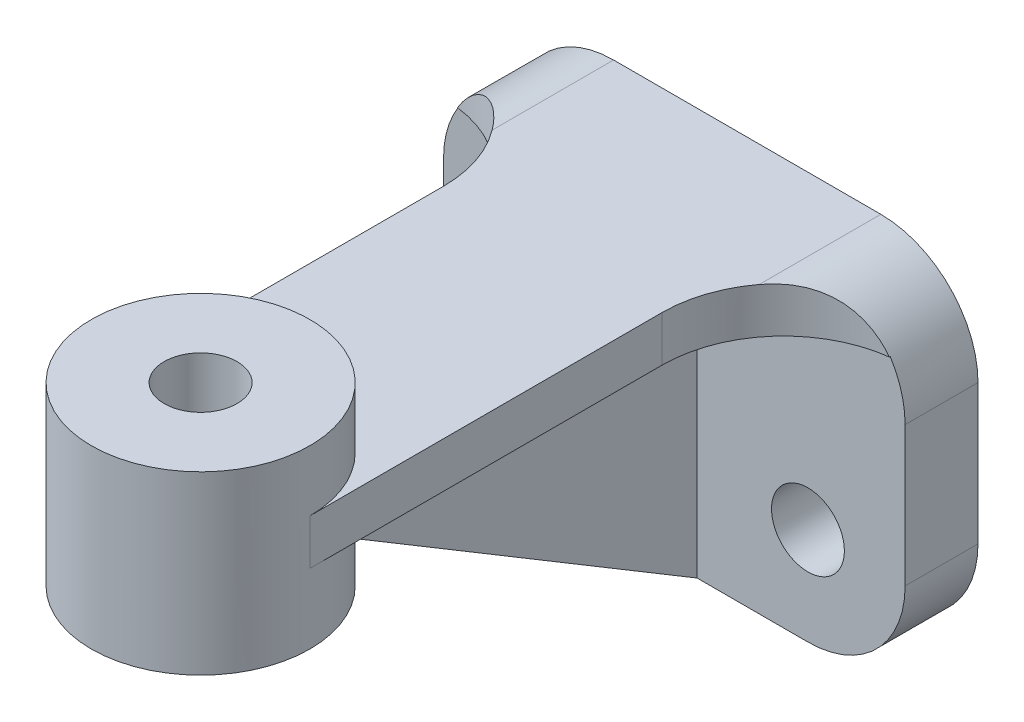
ISO-10303-21;
HEADER;
FILE_DESCRIPTION(('STEP AP214'),'2;1');
FILE_NAME('part.step','',(''),(''),'','','');
FILE_SCHEMA(('AUTOMOTIVE_DESIGN { 1 0 10303 214 1 1 1 1 }'));
ENDSEC;
DATA;
#1=APPLICATION_CONTEXT('core data for automotive mechanical design processes');
#2=APPLICATION_PROTOCOL_DEFINITION('international standard','automotive_design',2000,#1);
#3=PRODUCT_CONTEXT('',#1,'mechanical');
#4=PRODUCT('Part','Part','',(#3));
#5=PRODUCT_RELATED_PRODUCT_CATEGORY('part','',(#4));
#6=PRODUCT_DEFINITION_FORMATION('','',#4);
#7=PRODUCT_DEFINITION_CONTEXT('part definition',#1,'design');
#8=PRODUCT_DEFINITION('design','',#6,#7);
#9=PRODUCT_DEFINITION_SHAPE('','',#8);
#10=(LENGTH_UNIT() NAMED_UNIT(*) SI_UNIT(.MILLI.,.METRE.));
#11=(NAMED_UNIT(*) PLANE_ANGLE_UNIT() SI_UNIT($,.RADIAN.));
#12=(NAMED_UNIT(*) SI_UNIT($,.STERADIAN.) SOLID_ANGLE_UNIT());
#13=UNCERTAINTY_MEASURE_WITH_UNIT(LENGTH_MEASURE(1.E-05),#10,'distance_accuracy_value','');
#14=(GEOMETRIC_REPRESENTATION_CONTEXT(3) GLOBAL_UNCERTAINTY_ASSIGNED_CONTEXT((#13)) GLOBAL_UNIT_ASSIGNED_CONTEXT((#10,
#11,#12)) REPRESENTATION_CONTEXT('',''));
#15=CARTESIAN_POINT('',(0.,0.,0.));
#16=DIRECTION('',(0.,0.,1.));
#17=DIRECTION('',(1.,0.,0.));
#18=AXIS2_PLACEMENT_3D('',#15,#16,#17);
#19=CARTESIAN_POINT('',(0.,-55.,6.));
#20=DIRECTION('',(0.,0.,1.));
#21=DIRECTION('',(1.,0.,0.));
#22=AXIS2_PLACEMENT_3D('',#19,#20,#21);
#23=PLANE('',#22);
#24=CARTESIAN_POINT('',(22.,-39.,6.));
#25=DIRECTION('',(0.,0.,1.));
#26=DIRECTION('',(1.,0.,0.));
#27=AXIS2_PLACEMENT_3D('',#24,#25,#26);
#28=CIRCLE('',#27,5.99999999999999);
#29=CARTESIAN_POINT('',(28.,-39.,6.));
#30=VERTEX_POINT('',#29);
#31=EDGE_CURVE('E212',#30,#30,#28,.T.);
#32=ORIENTED_EDGE('',*,*,#31,.F.);
#33=EDGE_LOOP('',(#32));
#34=FACE_BOUND('',#33,.T.);
#35=CARTESIAN_POINT('',(22.,-16.,6.));
#36=DIRECTION('',(0.,0.,1.));
#37=DIRECTION('',(1.,0.,0.));
#38=AXIS2_PLACEMENT_3D('',#35,#36,#37);
#39=CIRCLE('',#38,16.);
#40=CARTESIAN_POINT('',(38.,-16.,6.));
#41=VERTEX_POINT('',#40);
#42=CARTESIAN_POINT('',(35.5554417117259,-7.5,6.));
#43=VERTEX_POINT('',#42);
#44=EDGE_CURVE('E295',#41,#43,#39,.T.);
#45=ORIENTED_EDGE('',*,*,#44,.T.);
#46=DIRECTION('',(1.,0.,0.));
#47=VECTOR('',#46,1.);
#48=CARTESIAN_POINT('',(0.,-7.5,6.));
#49=LINE('',#48,#47);
#50=CARTESIAN_POINT('',(3.75,-7.5,6.));
#51=VERTEX_POINT('',#50);
#52=EDGE_CURVE('E234',#51,#43,#49,.T.);
#53=ORIENTED_EDGE('',*,*,#52,.F.);
#54=DIRECTION('',(0.,-1.,0.));
#55=VECTOR('',#54,1.);
#56=CARTESIAN_POINT('',(3.75,-55.,6.));
#57=LINE('',#56,#55);
#58=CARTESIAN_POINT('',(3.75,-55.,5.99999999999998));
#59=VERTEX_POINT('',#58);
#60=EDGE_CURVE('E372',#51,#59,#57,.T.);
#61=ORIENTED_EDGE('',*,*,#60,.T.);
#62=DIRECTION('',(1.,0.,0.));
#63=VECTOR('',#62,1.);
#64=CARTESIAN_POINT('',(0.,-55.,6.));
#65=LINE('',#64,#63);
#66=CARTESIAN_POINT('',(22.,-55.,6.));
#67=VERTEX_POINT('',#66);
#68=EDGE_CURVE('E256',#59,#67,#65,.T.);
#69=ORIENTED_EDGE('',*,*,#68,.T.);
#70=CARTESIAN_POINT('',(22.,-39.,6.));
#71=DIRECTION('',(0.,0.,1.));
#72=DIRECTION('',(1.,0.,0.));
#73=AXIS2_PLACEMENT_3D('',#70,#71,#72);
#74=CIRCLE('',#73,16.);
#75=CARTESIAN_POINT('',(38.,-39.,6.));
#76=VERTEX_POINT('',#75);
#77=EDGE_CURVE('E298',#67,#76,#74,.T.);
#78=ORIENTED_EDGE('',*,*,#77,.T.);
#79=DIRECTION('',(0.,1.,0.));
#80=VECTOR('',#79,1.);
#81=CARTESIAN_POINT('',(38.,-55.,6.));
#82=LINE('',#81,#80);
#83=EDGE_CURVE('E258',#76,#41,#82,.T.);
#84=ORIENTED_EDGE('',*,*,#83,.T.);
#85=EDGE_LOOP('',(#45,#53,#61,#69,#78,#84));
#86=FACE_BOUND('',#85,.T.);
#87=ADVANCED_FACE('F41',(#34,#86),#23,.T.);
#88=CARTESIAN_POINT('',(0.,-7.5,0.));
#89=DIRECTION('',(0.,1.,0.));
#90=DIRECTION('',(0.,0.,1.));
#91=AXIS2_PLACEMENT_3D('',#88,#89,#90);
#92=PLANE('',#91);
#93=DIRECTION('',(0.,0.,1.));
#94=VECTOR('',#93,1.);
#95=CARTESIAN_POINT('',(3.75,-7.5,0.));
#96=LINE('',#95,#94);
#97=CARTESIAN_POINT('',(3.75000000000001,-7.5,66.3949581085418));
#98=VERTEX_POINT('',#97);
#99=EDGE_CURVE('E177',#51,#98,#96,.T.);
#100=ORIENTED_EDGE('',*,*,#99,.F.);
#101=ORIENTED_EDGE('',*,*,#52,.T.);
#102=DIRECTION('',(0.,0.,-1.));
#103=VECTOR('',#102,1.);
#104=CARTESIAN_POINT('',(35.555441711726,-7.5,6.14995882182531));
#105=LINE('',#104,#103);
#106=CARTESIAN_POINT('',(35.555441711726,-7.5,6.14995882182531));
#107=VERTEX_POINT('',#106);
#108=EDGE_CURVE('E11',#43,#107,#105,.F.);
#109=ORIENTED_EDGE('',*,*,#108,.T.);
#110=CARTESIAN_POINT('',(38.,-7.5,26.));
#111=DIRECTION('',(0.,1.,0.));
#112=DIRECTION('',(0.,0.,1.));
#113=AXIS2_PLACEMENT_3D('',#110,#111,#112);
#114=CIRCLE('',#113,20.);
#115=CARTESIAN_POINT('',(18.,-7.5,26.));
#116=VERTEX_POINT('',#115);
#117=EDGE_CURVE('E325',#107,#116,#114,.T.);
#118=ORIENTED_EDGE('',*,*,#117,.T.);
#119=DIRECTION('',(0.,0.,1.));
#120=VECTOR('',#119,1.);
#121=CARTESIAN_POINT('',(18.,-7.5,0.));
#122=LINE('',#121,#120);
#123=CARTESIAN_POINT('',(18.,-7.5,84.));
#124=VERTEX_POINT('',#123);
#125=EDGE_CURVE('E231',#116,#124,#122,.T.);
#126=ORIENTED_EDGE('',*,*,#125,.T.);
#127=CARTESIAN_POINT('',(0.,-7.5,84.));
#128=DIRECTION('',(0.,1.,0.));
#129=DIRECTION('',(0.,0.,1.));
#130=AXIS2_PLACEMENT_3D('',#127,#128,#129);
#131=CIRCLE('',#130,18.);
#132=EDGE_CURVE('E229',#124,#98,#131,.T.);
#133=ORIENTED_EDGE('',*,*,#132,.T.);
#134=EDGE_LOOP('',(#100,#101,#109,#118,#126,#133));
#135=FACE_BOUND('',#134,.T.);
#136=ADVANCED_FACE('F360',(#135),#92,.F.);
#137=CARTESIAN_POINT('',(-35.555441711726,-7.5,6.));
#138=VERTEX_POINT('',#137);
#139=CARTESIAN_POINT('',(-3.75,-7.5,6.));
#140=VERTEX_POINT('',#139);
#141=EDGE_CURVE('E235',#138,#140,#49,.T.);
#142=ORIENTED_EDGE('',*,*,#141,.F.);
#143=CARTESIAN_POINT('',(-22.,-16.,6.));
#144=DIRECTION('',(0.,0.,1.));
#145=DIRECTION('',(1.,0.,0.));
#146=AXIS2_PLACEMENT_3D('',#143,#144,#145);
#147=CIRCLE('',#146,16.);
#148=CARTESIAN_POINT('',(-38.,-16.,6.));
#149=VERTEX_POINT('',#148);
#150=EDGE_CURVE('E291',#138,#149,#147,.T.);
#151=ORIENTED_EDGE('',*,*,#150,.T.);
#152=DIRECTION('',(0.,1.,0.));
#153=VECTOR('',#152,1.);
#154=CARTESIAN_POINT('',(-38.,-55.,6.));
#155=LINE('',#154,#153);
#156=CARTESIAN_POINT('',(-38.,-39.,6.));
#157=VERTEX_POINT('',#156);
#158=EDGE_CURVE('E260',#157,#149,#155,.T.);
#159=ORIENTED_EDGE('',*,*,#158,.F.);
#160=CARTESIAN_POINT('',(-22.,-39.,6.));
#161=DIRECTION('',(0.,0.,1.));
#162=DIRECTION('',(1.,0.,0.));
#163=AXIS2_PLACEMENT_3D('',#160,#161,#162);
#164=CIRCLE('',#163,16.);
#165=CARTESIAN_POINT('',(-22.,-55.,6.));
#166=VERTEX_POINT('',#165);
#167=EDGE_CURVE('E293',#157,#166,#164,.T.);
#168=ORIENTED_EDGE('',*,*,#167,.T.);
#169=CARTESIAN_POINT('',(-3.75,-55.,5.99999999999998));
#170=VERTEX_POINT('',#169);
#171=EDGE_CURVE('E252',#166,#170,#65,.T.);
#172=ORIENTED_EDGE('',*,*,#171,.T.);
#173=DIRECTION('',(0.,-1.,0.));
#174=VECTOR('',#173,1.);
#175=CARTESIAN_POINT('',(-3.75,-55.,6.));
#176=LINE('',#175,#174);
#177=EDGE_CURVE('E182',#140,#170,#176,.T.);
#178=ORIENTED_EDGE('',*,*,#177,.F.);
#179=EDGE_LOOP('',(#142,#151,#159,#168,#172,#178));
#180=FACE_BOUND('',#179,.T.);
#181=CARTESIAN_POINT('',(-22.,-39.,6.));
#182=DIRECTION('',(0.,0.,1.));
#183=DIRECTION('',(1.,0.,0.));
#184=AXIS2_PLACEMENT_3D('',#181,#182,#183);
#185=CIRCLE('',#184,5.99999999999999);
#186=CARTESIAN_POINT('',(-16.,-39.,6.));
#187=VERTEX_POINT('',#186);
#188=EDGE_CURVE('E200',#187,#187,#185,.T.);
#189=ORIENTED_EDGE('',*,*,#188,.F.);
#190=EDGE_LOOP('',(#189));
#191=FACE_BOUND('',#190,.T.);
#192=ADVANCED_FACE('F414',(#180,#191),#23,.T.);
#193=CARTESIAN_POINT('',(-38.,-55.,0.));
#194=DIRECTION('',(1.,0.,0.));
#195=DIRECTION('',(0.,0.,-1.));
#196=AXIS2_PLACEMENT_3D('',#193,#194,#195);
#197=PLANE('',#196);
#198=DIRECTION('',(0.,1.,0.));
#199=VECTOR('',#198,1.);
#200=CARTESIAN_POINT('',(-38.,-55.,-6.));
#201=LINE('',#200,#199);
#202=CARTESIAN_POINT('',(-38.,-39.,-6.));
#203=VERTEX_POINT('',#202);
#204=CARTESIAN_POINT('',(-38.,-16.,-6.));
#205=VERTEX_POINT('',#204);
#206=EDGE_CURVE('E264',#203,#205,#201,.T.);
#207=ORIENTED_EDGE('',*,*,#206,.F.);
#208=DIRECTION('',(0.,0.,-1.));
#209=VECTOR('',#208,1.);
#210=CARTESIAN_POINT('',(-38.,-39.,0.));
#211=LINE('',#210,#209);
#212=EDGE_CURVE('E308',#203,#157,#211,.F.);
#213=ORIENTED_EDGE('',*,*,#212,.T.);
#214=ORIENTED_EDGE('',*,*,#158,.T.);
#215=DIRECTION('',(0.,0.,-1.));
#216=VECTOR('',#215,1.);
#217=CARTESIAN_POINT('',(-38.,-16.,-6.));
#218=LINE('',#217,#216);
#219=EDGE_CURVE('E305',#149,#205,#218,.T.);
#220=ORIENTED_EDGE('',*,*,#219,.T.);
#221=EDGE_LOOP('',(#207,#213,#214,#220));
#222=FACE_BOUND('',#221,.T.);
#223=ADVANCED_FACE('F421',(#222),#197,.F.);
#224=CARTESIAN_POINT('',(0.,-55.,-6.));
#225=DIRECTION('',(0.,0.,1.));
#226=DIRECTION('',(1.,0.,0.));
#227=AXIS2_PLACEMENT_3D('',#224,#225,#226);
#228=PLANE('',#227);
#229=CARTESIAN_POINT('',(-22.,-39.,-6.));
#230=DIRECTION('',(0.,0.,1.));
#231=DIRECTION('',(1.,0.,0.));
#232=AXIS2_PLACEMENT_3D('',#229,#230,#231);
#233=CIRCLE('',#232,5.99999999999999);
#234=CARTESIAN_POINT('',(-16.,-39.,-6.));
#235=VERTEX_POINT('',#234);
#236=EDGE_CURVE('E209',#235,#235,#233,.T.);
#237=ORIENTED_EDGE('',*,*,#236,.T.);
#238=EDGE_LOOP('',(#237));
#239=FACE_BOUND('',#238,.T.);
#240=DIRECTION('',(1.,0.,0.));
#241=VECTOR('',#240,1.);
#242=CARTESIAN_POINT('',(0.,0.,-6.));
#243=LINE('',#242,#241);
#244=CARTESIAN_POINT('',(-22.,0.,-6.));
#245=VERTEX_POINT('',#244);
#246=CARTESIAN_POINT('',(22.,0.,-6.));
#247=VERTEX_POINT('',#246);
#248=EDGE_CURVE('E249',#245,#247,#243,.T.);
#249=ORIENTED_EDGE('',*,*,#248,.T.);
#250=CARTESIAN_POINT('',(22.,-16.,-6.));
#251=DIRECTION('',(0.,0.,1.));
#252=DIRECTION('',(1.,0.,0.));
#253=AXIS2_PLACEMENT_3D('',#250,#251,#252);
#254=CIRCLE('',#253,16.);
#255=CARTESIAN_POINT('',(38.,-16.,-6.));
#256=VERTEX_POINT('',#255);
#257=EDGE_CURVE('E280',#247,#256,#254,.F.);
#258=ORIENTED_EDGE('',*,*,#257,.T.);
#259=DIRECTION('',(0.,1.,0.));
#260=VECTOR('',#259,1.);
#261=CARTESIAN_POINT('',(38.,-55.,-6.));
#262=LINE('',#261,#260);
#263=CARTESIAN_POINT('',(38.,-39.,-6.));
#264=VERTEX_POINT('',#263);
#265=EDGE_CURVE('E267',#264,#256,#262,.T.);
#266=ORIENTED_EDGE('',*,*,#265,.F.);
#267=CARTESIAN_POINT('',(22.,-39.,-6.));
#268=DIRECTION('',(0.,0.,1.));
#269=DIRECTION('',(1.,0.,0.));
#270=AXIS2_PLACEMENT_3D('',#267,#268,#269);
#271=CIRCLE('',#270,16.);
#272=CARTESIAN_POINT('',(22.,-55.,-6.));
#273=VERTEX_POINT('',#272);
#274=EDGE_CURVE('E282',#264,#273,#271,.F.);
#275=ORIENTED_EDGE('',*,*,#274,.T.);
#276=DIRECTION('',(1.,0.,0.));
#277=VECTOR('',#276,1.);
#278=CARTESIAN_POINT('',(0.,-55.,-6.));
#279=LINE('',#278,#277);
#280=CARTESIAN_POINT('',(-22.,-55.,-6.));
#281=VERTEX_POINT('',#280);
#282=EDGE_CURVE('E255',#281,#273,#279,.T.);
#283=ORIENTED_EDGE('',*,*,#282,.F.);
#284=CARTESIAN_POINT('',(-22.,-39.,-6.));
#285=DIRECTION('',(0.,0.,1.));
#286=DIRECTION('',(1.,0.,0.));
#287=AXIS2_PLACEMENT_3D('',#284,#285,#286);
#288=CIRCLE('',#287,16.);
#289=EDGE_CURVE('E278',#281,#203,#288,.F.);
#290=ORIENTED_EDGE('',*,*,#289,.T.);
#291=ORIENTED_EDGE('',*,*,#206,.T.);
#292=CARTESIAN_POINT('',(-22.,-16.,-6.));
#293=DIRECTION('',(0.,0.,1.));
#294=DIRECTION('',(1.,0.,0.));
#295=AXIS2_PLACEMENT_3D('',#292,#293,#294);
#296=CIRCLE('',#295,16.);
#297=EDGE_CURVE('E276',#205,#245,#296,.F.);
#298=ORIENTED_EDGE('',*,*,#297,.T.);
#299=EDGE_LOOP('',(#249,#258,#266,#275,#283,#290,#291,#298));
#300=FACE_BOUND('',#299,.T.);
#301=CARTESIAN_POINT('',(22.,-39.,-6.));
#302=DIRECTION('',(0.,0.,1.));
#303=DIRECTION('',(1.,0.,0.));
#304=AXIS2_PLACEMENT_3D('',#301,#302,#303);
#305=CIRCLE('',#304,5.99999999999999);
#306=CARTESIAN_POINT('',(28.,-39.,-6.));
#307=VERTEX_POINT('',#306);
#308=EDGE_CURVE('E215',#307,#307,#305,.T.);
#309=ORIENTED_EDGE('',*,*,#308,.T.);
#310=EDGE_LOOP('',(#309));
#311=FACE_BOUND('',#310,.T.);
#312=ADVANCED_FACE('F385',(#239,#300,#311),#228,.F.);
#313=CARTESIAN_POINT('',(38.,-55.,0.));
#314=DIRECTION('',(1.,0.,0.));
#315=DIRECTION('',(0.,0.,-1.));
#316=AXIS2_PLACEMENT_3D('',#313,#314,#315);
#317=PLANE('',#316);
#318=ORIENTED_EDGE('',*,*,#83,.F.);
#319=DIRECTION('',(0.,0.,-1.));
#320=VECTOR('',#319,1.);
#321=CARTESIAN_POINT('',(38.,-39.,-6.));
#322=LINE('',#321,#320);
#323=EDGE_CURVE('E273',#76,#264,#322,.T.);
#324=ORIENTED_EDGE('',*,*,#323,.T.);
#325=ORIENTED_EDGE('',*,*,#265,.T.);
#326=DIRECTION('',(0.,0.,-1.));
#327=VECTOR('',#326,1.);
#328=CARTESIAN_POINT('',(38.,-16.,0.));
#329=LINE('',#328,#327);
#330=EDGE_CURVE('E263',#256,#41,#329,.F.);
#331=ORIENTED_EDGE('',*,*,#330,.T.);
#332=EDGE_LOOP('',(#318,#324,#325,#331));
#333=FACE_BOUND('',#332,.T.);
#334=ADVANCED_FACE('F381',(#333),#317,.T.);
#335=CARTESIAN_POINT('',(0.,-55.,0.));
#336=DIRECTION('',(0.,1.,0.));
#337=DIRECTION('',(0.,0.,1.));
#338=AXIS2_PLACEMENT_3D('',#335,#336,#337);
#339=PLANE('',#338);
#340=ORIENTED_EDGE('',*,*,#282,.T.);
#341=DIRECTION('',(0.,0.,-1.));
#342=VECTOR('',#341,1.);
#343=CARTESIAN_POINT('',(22.,-55.,6.));
#344=LINE('',#343,#342);
#345=EDGE_CURVE('E288',#273,#67,#344,.F.);
#346=ORIENTED_EDGE('',*,*,#345,.T.);
#347=ORIENTED_EDGE('',*,*,#68,.F.);
#348=DIRECTION('',(-1.,0.,0.));
#349=VECTOR('',#348,1.);
#350=CARTESIAN_POINT('',(0.,-55.,6.00000000000001));
#351=LINE('',#350,#349);
#352=EDGE_CURVE('E190',#170,#59,#351,.F.);
#353=ORIENTED_EDGE('',*,*,#352,.F.);
#354=ORIENTED_EDGE('',*,*,#171,.F.);
#355=DIRECTION('',(0.,0.,-1.));
#356=VECTOR('',#355,1.);
#357=CARTESIAN_POINT('',(-22.,-55.,0.));
#358=LINE('',#357,#356);
#359=EDGE_CURVE('E285',#166,#281,#358,.T.);
#360=ORIENTED_EDGE('',*,*,#359,.T.);
#361=EDGE_LOOP('',(#340,#346,#347,#353,#354,#360));
#362=FACE_BOUND('',#361,.T.);
#363=ADVANCED_FACE('F412',(#362),#339,.F.);
#364=CARTESIAN_POINT('',(0.,0.,0.));
#365=DIRECTION('',(0.,1.,0.));
#366=DIRECTION('',(0.,0.,1.));
#367=AXIS2_PLACEMENT_3D('',#364,#365,#366);
#368=PLANE('',#367);
#369=DIRECTION('',(0.,0.,-1.));
#370=VECTOR('',#369,1.);
#371=CARTESIAN_POINT('',(-22.,0.,6.));
#372=LINE('',#371,#370);
#373=CARTESIAN_POINT('',(-22.,0.,13.9999999999999));
#374=VERTEX_POINT('',#373);
#375=EDGE_CURVE('E300',#245,#374,#372,.F.);
#376=ORIENTED_EDGE('',*,*,#375,.T.);
#377=CARTESIAN_POINT('',(-38.,0.,26.));
#378=DIRECTION('',(0.,1.,0.));
#379=DIRECTION('',(0.,0.,1.));
#380=AXIS2_PLACEMENT_3D('',#377,#378,#379);
#381=CIRCLE('',#380,20.);
#382=CARTESIAN_POINT('',(-18.,0.,26.));
#383=VERTEX_POINT('',#382);
#384=EDGE_CURVE('E353',#374,#383,#381,.F.);
#385=ORIENTED_EDGE('',*,*,#384,.T.);
#386=DIRECTION('',(0.,0.,1.));
#387=VECTOR('',#386,1.);
#388=CARTESIAN_POINT('',(-18.,0.,0.));
#389=LINE('',#388,#387);
#390=CARTESIAN_POINT('',(-18.,0.,84.));
#391=VERTEX_POINT('',#390);
#392=EDGE_CURVE('E244',#383,#391,#389,.T.);
#393=ORIENTED_EDGE('',*,*,#392,.T.);
#394=CARTESIAN_POINT('',(0.,0.,84.));
#395=DIRECTION('',(0.,1.,0.));
#396=DIRECTION('',(0.,0.,1.));
#397=AXIS2_PLACEMENT_3D('',#394,#395,#396);
#398=CIRCLE('',#397,18.);
#399=CARTESIAN_POINT('',(18.,0.,84.));
#400=VERTEX_POINT('',#399);
#401=EDGE_CURVE('E228',#400,#391,#398,.T.);
#402=ORIENTED_EDGE('',*,*,#401,.F.);
#403=DIRECTION('',(0.,0.,1.));
#404=VECTOR('',#403,1.);
#405=CARTESIAN_POINT('',(18.,0.,0.));
#406=LINE('',#405,#404);
#407=CARTESIAN_POINT('',(18.,0.,26.));
#408=VERTEX_POINT('',#407);
#409=EDGE_CURVE('E242',#408,#400,#406,.T.);
#410=ORIENTED_EDGE('',*,*,#409,.F.);
#411=CARTESIAN_POINT('',(38.,0.,26.));
#412=DIRECTION('',(0.,1.,0.));
#413=DIRECTION('',(0.,0.,1.));
#414=AXIS2_PLACEMENT_3D('',#411,#412,#413);
#415=CIRCLE('',#414,20.);
#416=CARTESIAN_POINT('',(22.,0.,13.9999999999999));
#417=VERTEX_POINT('',#416);
#418=EDGE_CURVE('E316',#408,#417,#415,.F.);
#419=ORIENTED_EDGE('',*,*,#418,.T.);
#420=DIRECTION('',(0.,0.,-1.));
#421=VECTOR('',#420,1.);
#422=CARTESIAN_POINT('',(22.,0.,0.));
#423=LINE('',#422,#421);
#424=EDGE_CURVE('E302',#417,#247,#423,.T.);
#425=ORIENTED_EDGE('',*,*,#424,.T.);
#426=ORIENTED_EDGE('',*,*,#248,.F.);
#427=EDGE_LOOP('',(#376,#385,#393,#402,#410,#419,#425,#426));
#428=FACE_BOUND('',#427,.T.);
#429=ADVANCED_FACE('F367',(#428),#368,.T.);
#430=CARTESIAN_POINT('',(-18.,-7.5,0.));
#431=DIRECTION('',(-1.,0.,0.));
#432=DIRECTION('',(0.,0.,1.));
#433=AXIS2_PLACEMENT_3D('',#430,#431,#432);
#434=PLANE('',#433);
#435=ORIENTED_EDGE('',*,*,#392,.F.);
#436=DIRECTION('',(0.,1.,0.));
#437=VECTOR('',#436,1.);
#438=CARTESIAN_POINT('',(-18.,-7.5,26.));
#439=LINE('',#438,#437);
#440=CARTESIAN_POINT('',(-18.,-7.5,26.));
#441=VERTEX_POINT('',#440);
#442=EDGE_CURVE('E313',#383,#441,#439,.F.);
#443=ORIENTED_EDGE('',*,*,#442,.T.);
#444=DIRECTION('',(0.,0.,1.));
#445=VECTOR('',#444,1.);
#446=CARTESIAN_POINT('',(-18.,-7.5,0.));
#447=LINE('',#446,#445);
#448=CARTESIAN_POINT('',(-18.,-7.5,84.));
#449=VERTEX_POINT('',#448);
#450=EDGE_CURVE('E238',#441,#449,#447,.T.);
#451=ORIENTED_EDGE('',*,*,#450,.T.);
#452=DIRECTION('',(0.,1.,0.));
#453=VECTOR('',#452,1.);
#454=CARTESIAN_POINT('',(-18.,-7.5,84.));
#455=LINE('',#454,#453);
#456=EDGE_CURVE('E246',#449,#391,#455,.T.);
#457=ORIENTED_EDGE('',*,*,#456,.T.);
#458=EDGE_LOOP('',(#435,#443,#451,#457));
#459=FACE_BOUND('',#458,.T.);
#460=ADVANCED_FACE('F396',(#459),#434,.T.);
#461=CARTESIAN_POINT('',(18.,-7.5,0.));
#462=DIRECTION('',(-1.,0.,0.));
#463=DIRECTION('',(0.,0.,1.));
#464=AXIS2_PLACEMENT_3D('',#461,#462,#463);
#465=PLANE('',#464);
#466=ORIENTED_EDGE('',*,*,#125,.F.);
#467=DIRECTION('',(0.,1.,0.));
#468=VECTOR('',#467,1.);
#469=CARTESIAN_POINT('',(18.,-7.5,26.));
#470=LINE('',#469,#468);
#471=EDGE_CURVE('E310',#116,#408,#470,.T.);
#472=ORIENTED_EDGE('',*,*,#471,.T.);
#473=ORIENTED_EDGE('',*,*,#409,.T.);
#474=DIRECTION('',(0.,1.,0.));
#475=VECTOR('',#474,1.);
#476=CARTESIAN_POINT('',(18.,-7.5,84.));
#477=LINE('',#476,#475);
#478=EDGE_CURVE('E240',#124,#400,#477,.T.);
#479=ORIENTED_EDGE('',*,*,#478,.F.);
#480=EDGE_LOOP('',(#466,#472,#473,#479));
#481=FACE_BOUND('',#480,.T.);
#482=ADVANCED_FACE('F365',(#481),#465,.F.);
#483=ORIENTED_EDGE('',*,*,#141,.T.);
#484=DIRECTION('',(0.,0.,1.));
#485=VECTOR('',#484,1.);
#486=CARTESIAN_POINT('',(-3.75,-7.5,0.));
#487=LINE('',#486,#485);
#488=CARTESIAN_POINT('',(-3.74999999999999,-7.5,66.3949581085417));
#489=VERTEX_POINT('',#488);
#490=EDGE_CURVE('E204',#140,#489,#487,.T.);
#491=ORIENTED_EDGE('',*,*,#490,.T.);
#492=EDGE_CURVE('E232',#489,#449,#131,.T.);
#493=ORIENTED_EDGE('',*,*,#492,.T.);
#494=ORIENTED_EDGE('',*,*,#450,.F.);
#495=CARTESIAN_POINT('',(-38.,-7.5,26.));
#496=DIRECTION('',(0.,1.,0.));
#497=DIRECTION('',(0.,0.,1.));
#498=AXIS2_PLACEMENT_3D('',#495,#496,#497);
#499=CIRCLE('',#498,20.);
#500=CARTESIAN_POINT('',(-35.555441711726,-7.5,6.14995882182531));
#501=VERTEX_POINT('',#500);
#502=EDGE_CURVE('E65',#441,#501,#499,.T.);
#503=ORIENTED_EDGE('',*,*,#502,.T.);
#504=DIRECTION('',(0.,0.,1.));
#505=VECTOR('',#504,1.);
#506=CARTESIAN_POINT('',(-35.555441711726,-7.5,6.));
#507=LINE('',#506,#505);
#508=EDGE_CURVE('E46',#138,#501,#507,.T.);
#509=ORIENTED_EDGE('',*,*,#508,.F.);
#510=EDGE_LOOP('',(#483,#491,#493,#494,#503,#509));
#511=FACE_BOUND('',#510,.T.);
#512=ADVANCED_FACE('F398',(#511),#92,.F.);
#513=CARTESIAN_POINT('',(0.,-19.,84.));
#514=DIRECTION('',(0.,1.,0.));
#515=DIRECTION('',(0.,0.,1.));
#516=AXIS2_PLACEMENT_3D('',#513,#514,#515);
#517=CYLINDRICAL_SURFACE('',#516,6.00000000000001);
#518=CARTESIAN_POINT('',(0.,10.,84.));
#519=DIRECTION('',(0.,1.,0.));
#520=DIRECTION('',(0.,0.,1.));
#521=AXIS2_PLACEMENT_3D('',#518,#519,#520);
#522=CIRCLE('',#521,6.00000000000001);
#523=CARTESIAN_POINT('',(0.,10.,90.));
#524=VERTEX_POINT('',#523);
#525=EDGE_CURVE('E218',#524,#524,#522,.T.);
#526=ORIENTED_EDGE('',*,*,#525,.T.);
#527=EDGE_LOOP('',(#526));
#528=FACE_BOUND('',#527,.T.);
#529=CARTESIAN_POINT('',(0.,-19.,84.));
#530=DIRECTION('',(0.,1.,0.));
#531=DIRECTION('',(0.,0.,1.));
#532=AXIS2_PLACEMENT_3D('',#529,#530,#531);
#533=CIRCLE('',#532,6.00000000000001);
#534=CARTESIAN_POINT('',(0.,-19.,90.));
#535=VERTEX_POINT('',#534);
#536=EDGE_CURVE('E224',#535,#535,#533,.T.);
#537=ORIENTED_EDGE('',*,*,#536,.F.);
#538=EDGE_LOOP('',(#537));
#539=FACE_BOUND('',#538,.T.);
#540=ADVANCED_FACE('F453',(#528,#539),#517,.F.);
#541=CARTESIAN_POINT('',(0.,-19.,84.));
#542=DIRECTION('',(0.,1.,0.));
#543=DIRECTION('',(0.,0.,1.));
#544=AXIS2_PLACEMENT_3D('',#541,#542,#543);
#545=CYLINDRICAL_SURFACE('',#544,18.);
#546=CARTESIAN_POINT('',(0.,10.,84.));
#547=DIRECTION('',(0.,1.,0.));
#548=DIRECTION('',(0.,0.,1.));
#549=AXIS2_PLACEMENT_3D('',#546,#547,#548);
#550=CIRCLE('',#549,18.);
#551=CARTESIAN_POINT('',(0.,10.,102.));
#552=VERTEX_POINT('',#551);
#553=EDGE_CURVE('E221',#552,#552,#550,.T.);
#554=ORIENTED_EDGE('',*,*,#553,.F.);
#555=EDGE_LOOP('',(#554));
#556=FACE_BOUND('',#555,.T.);
#557=ORIENTED_EDGE('',*,*,#401,.T.);
#558=ORIENTED_EDGE('',*,*,#456,.F.);
#559=ORIENTED_EDGE('',*,*,#492,.F.);
#560=DIRECTION('',(0.,1.,0.));
#561=VECTOR('',#560,1.);
#562=CARTESIAN_POINT('',(-3.74999999999999,-19.,66.3949581085417));
#563=LINE('',#562,#561);
#564=CARTESIAN_POINT('',(-3.74999999999999,-18.763025134875,66.3949581085417));
#565=VERTEX_POINT('',#564);
#566=EDGE_CURVE('E202',#565,#489,#563,.T.);
#567=ORIENTED_EDGE('',*,*,#566,.F.);
#568=CARTESIAN_POINT('',(0.,-8.2,84.));
#569=DIRECTION('',(0.,0.857492925712544,-0.514495755427526));
#570=DIRECTION('',(0.,0.514495755427527,0.857492925712544));
#571=AXIS2_PLACEMENT_3D('',#568,#569,#570);
#572=ELLIPSE('',#571,20.9914268214431,18.);
#573=CARTESIAN_POINT('',(0.,-19.,66.));
#574=VERTEX_POINT('',#573);
#575=EDGE_CURVE('E198',#574,#565,#572,.T.);
#576=ORIENTED_EDGE('',*,*,#575,.F.);
#577=CARTESIAN_POINT('',(0.,-19.,84.));
#578=DIRECTION('',(0.,1.,0.));
#579=DIRECTION('',(0.,0.,1.));
#580=AXIS2_PLACEMENT_3D('',#577,#578,#579);
#581=CIRCLE('',#580,18.);
#582=EDGE_CURVE('E197',#574,#574,#581,.T.);
#583=ORIENTED_EDGE('',*,*,#582,.T.);
#584=CARTESIAN_POINT('',(3.75000000000001,-18.7630251348749,66.3949581085418));
#585=VERTEX_POINT('',#584);
#586=EDGE_CURVE('E187',#585,#574,#572,.T.);
#587=ORIENTED_EDGE('',*,*,#586,.F.);
#588=DIRECTION('',(0.,1.,0.));
#589=VECTOR('',#588,1.);
#590=CARTESIAN_POINT('',(3.75000000000001,-19.,66.3949581085418));
#591=LINE('',#590,#589);
#592=EDGE_CURVE('E171',#585,#98,#591,.T.);
#593=ORIENTED_EDGE('',*,*,#592,.T.);
#594=ORIENTED_EDGE('',*,*,#132,.F.);
#595=ORIENTED_EDGE('',*,*,#478,.T.);
#596=EDGE_LOOP('',(#557,#558,#559,#567,#576,#583,#587,#593,#594,#595));
#597=FACE_BOUND('',#596,.T.);
#598=ADVANCED_FACE('F195',(#556,#597),#545,.T.);
#599=CARTESIAN_POINT('',(0.,-19.,0.));
#600=DIRECTION('',(0.,1.,0.));
#601=DIRECTION('',(0.,0.,1.));
#602=AXIS2_PLACEMENT_3D('',#599,#600,#601);
#603=PLANE('',#602);
#604=ORIENTED_EDGE('',*,*,#536,.T.);
#605=EDGE_LOOP('',(#604));
#606=FACE_BOUND('',#605,.T.);
#607=ORIENTED_EDGE('',*,*,#582,.F.);
#608=EDGE_LOOP('',(#607));
#609=FACE_BOUND('',#608,.T.);
#610=ADVANCED_FACE('F459',(#606,#609),#603,.F.);
#611=CARTESIAN_POINT('',(0.,10.,0.));
#612=DIRECTION('',(0.,1.,0.));
#613=DIRECTION('',(0.,0.,1.));
#614=AXIS2_PLACEMENT_3D('',#611,#612,#613);
#615=PLANE('',#614);
#616=ORIENTED_EDGE('',*,*,#525,.F.);
#617=EDGE_LOOP('',(#616));
#618=FACE_BOUND('',#617,.T.);
#619=ORIENTED_EDGE('',*,*,#553,.T.);
#620=EDGE_LOOP('',(#619));
#621=FACE_BOUND('',#620,.T.);
#622=ADVANCED_FACE('F463',(#618,#621),#615,.T.);
#623=CARTESIAN_POINT('',(22.,-39.,0.));
#624=DIRECTION('',(0.,0.,1.));
#625=DIRECTION('',(1.,0.,0.));
#626=AXIS2_PLACEMENT_3D('',#623,#624,#625);
#627=CYLINDRICAL_SURFACE('',#626,16.);
#628=ORIENTED_EDGE('',*,*,#77,.F.);
#629=ORIENTED_EDGE('',*,*,#345,.F.);
#630=ORIENTED_EDGE('',*,*,#274,.F.);
#631=ORIENTED_EDGE('',*,*,#323,.F.);
#632=EDGE_LOOP('',(#628,#629,#630,#631));
#633=FACE_BOUND('',#632,.T.);
#634=ADVANCED_FACE('F336',(#633),#627,.T.);
#635=CARTESIAN_POINT('',(22.,-16.,0.));
#636=DIRECTION('',(0.,0.,-1.));
#637=DIRECTION('',(-1.,0.,0.));
#638=AXIS2_PLACEMENT_3D('',#635,#636,#637);
#639=CYLINDRICAL_SURFACE('',#638,16.);
#640=ORIENTED_EDGE('',*,*,#44,.F.);
#641=ORIENTED_EDGE('',*,*,#330,.F.);
#642=ORIENTED_EDGE('',*,*,#257,.F.);
#643=ORIENTED_EDGE('',*,*,#424,.F.);
#644=CARTESIAN_POINT('',(22.,0.,13.9999999999999));
#645=CARTESIAN_POINT('',(22.1317305216772,-1.77591145781467E-06,13.8243585384925));
#646=CARTESIAN_POINT('',(22.2663448456501,-0.00162701745102144,13.6509000993324));
#647=CARTESIAN_POINT('',(22.5411847691858,-0.00856373137922175,13.3085369822145));
#648=CARTESIAN_POINT('',(22.6814109069306,-0.0138755581194161,13.1396327436242));
#649=CARTESIAN_POINT('',(23.1104259778802,-0.0360095093443827,12.639858969574));
#650=CARTESIAN_POINT('',(23.4073738582899,-0.0590312881927601,12.3161652777516));
#651=CARTESIAN_POINT('',(24.0226322168005,-0.125326937820467,11.688201955846));
#652=CARTESIAN_POINT('',(24.3410581048257,-0.168719167220745,11.384057814805));
#653=CARTESIAN_POINT('',(24.9948974718323,-0.279298673091153,10.7993572861812));
#654=CARTESIAN_POINT('',(25.3303060309927,-0.346479091624735,10.5187941292118));
#655=CARTESIAN_POINT('',(26.017005942865,-0.508424797009997,9.98128553496637));
#656=CARTESIAN_POINT('',(26.3683887072655,-0.60337201203651,9.72451105943808));
#657=CARTESIAN_POINT('',(27.080617435578,-0.823497907549795,9.23834808285384));
#658=CARTESIAN_POINT('',(27.4414641741307,-0.948679069658268,9.00896183215169));
#659=CARTESIAN_POINT('',(28.1660818769396,-1.23077637961083,8.57958913284775));
#660=CARTESIAN_POINT('',(28.5298353874937,-1.38756367898142,8.37948883468008));
#661=CARTESIAN_POINT('',(29.2561626813693,-1.73430865845011,8.0080114821682));
#662=CARTESIAN_POINT('',(29.6187366387648,-1.92426119475988,7.83662998172575));
#663=CARTESIAN_POINT('',(30.2947507075964,-2.31311505602199,7.54061466391366));
#664=CARTESIAN_POINT('',(30.6089508863464,-2.50833142734848,7.41285281637994));
#665=CARTESIAN_POINT('',(31.2282757540555,-2.92414430369643,7.17838015276858));
#666=CARTESIAN_POINT('',(31.5334007057961,-3.14474007293222,7.07166872665196));
#667=CARTESIAN_POINT('',(32.1316124475398,-3.61071084535492,6.87773206604763));
#668=CARTESIAN_POINT('',(32.4246749942556,-3.85613262089505,6.79054464626708));
#669=CARTESIAN_POINT('',(32.9949575891994,-4.36994595237246,6.63412871420664));
#670=CARTESIAN_POINT('',(33.2721801099041,-4.63833390708426,6.56489739314775));
#671=CARTESIAN_POINT('',(33.7287354982231,-5.11372416972656,6.46045611043818));
#672=CARTESIAN_POINT('',(33.9127592599562,-5.31538844842396,6.42124110538915));
#673=CARTESIAN_POINT('',(34.2708174953744,-5.72859534331955,6.34989799268024));
#674=CARTESIAN_POINT('',(34.4448524047027,-5.9401375279825,6.3177695757795));
#675=CARTESIAN_POINT('',(34.7815375602037,-6.37156009098755,6.2599244620881));
#676=CARTESIAN_POINT('',(34.9442301355408,-6.59140415773452,6.23418289406667));
#677=CARTESIAN_POINT('',(35.2583996193568,-7.03954050613263,6.18816560603916));
#678=CARTESIAN_POINT('',(35.4098758078516,-7.26783332870431,6.16789023669018));
#679=CARTESIAN_POINT('',(35.555441711726,-7.5,6.14995882182531));
#680=B_SPLINE_CURVE_WITH_KNOTS('',3,(#644,#645,#646,#647,#648,#649,#650,#651,#652,#653,#654,
#655,#656,#657,#658,#659,#660,#661,#662,#663,#664,#665,#666,#667,#668,#669,#670,#671,#672,#673,
#674,#675,#676,#677,#678,#679),.UNSPECIFIED.,.F.,.F.,(4,2,2,2,2,2,2,2,2,2,2,2,2,2,2,2,2,4),(0.,
0.658582479793435,1.31722827076535,2.63540605740239,3.96133949808677,5.28689099402108,
6.62132990859825,7.95587839202084,9.28509252860317,10.6141006925137,11.7866793049235,
12.9592239311358,14.1340203049663,15.3086328005356,16.1356431202507,16.9626173441759,
17.7863188125775,18.6100731089307),.UNSPECIFIED.);
#681=EDGE_CURVE('E57',#417,#107,#680,.T.);
#682=ORIENTED_EDGE('',*,*,#681,.T.);
#683=ORIENTED_EDGE('',*,*,#108,.F.);
#684=EDGE_LOOP('',(#640,#641,#642,#643,#682,#683));
#685=FACE_BOUND('',#684,.T.);
#686=ADVANCED_FACE('F330',(#685),#639,.T.);
#687=CARTESIAN_POINT('',(-22.,-39.,0.));
#688=DIRECTION('',(0.,0.,-1.));
#689=DIRECTION('',(-1.,0.,0.));
#690=AXIS2_PLACEMENT_3D('',#687,#688,#689);
#691=CYLINDRICAL_SURFACE('',#690,16.);
#692=ORIENTED_EDGE('',*,*,#167,.F.);
#693=ORIENTED_EDGE('',*,*,#212,.F.);
#694=ORIENTED_EDGE('',*,*,#289,.F.);
#695=ORIENTED_EDGE('',*,*,#359,.F.);
#696=EDGE_LOOP('',(#692,#693,#694,#695));
#697=FACE_BOUND('',#696,.T.);
#698=ADVANCED_FACE('F335',(#697),#691,.T.);
#699=CARTESIAN_POINT('',(-22.,-16.,0.));
#700=DIRECTION('',(0.,0.,1.));
#701=DIRECTION('',(1.,0.,0.));
#702=AXIS2_PLACEMENT_3D('',#699,#700,#701);
#703=CYLINDRICAL_SURFACE('',#702,16.);
#704=ORIENTED_EDGE('',*,*,#150,.F.);
#705=ORIENTED_EDGE('',*,*,#508,.T.);
#706=CARTESIAN_POINT('',(-35.555441711726,-7.5,6.14995882182531));
#707=CARTESIAN_POINT('',(-35.4498678557994,-7.33163399587542,6.16296216770422));
#708=CARTESIAN_POINT('',(-35.3412084785172,-7.16532061685299,6.17719699064936));
#709=CARTESIAN_POINT('',(-35.1178977687483,-6.83702129669952,6.20843066262853));
#710=CARTESIAN_POINT('',(-35.0032461385278,-6.67503557119968,6.2254296490928));
#711=CARTESIAN_POINT('',(-34.6505424715201,-6.19586650443972,6.28102954321658));
#712=CARTESIAN_POINT('',(-34.4037824694473,-5.88553630906488,6.32422860809411));
#713=CARTESIAN_POINT('',(-33.8887316672965,-5.28482716905667,6.42536168883364));
#714=CARTESIAN_POINT('',(-33.620400358818,-4.99448775590475,6.48332389241814));
#715=CARTESIAN_POINT('',(-33.0651597664849,-4.43638816234412,6.61627495386009));
#716=CARTESIAN_POINT('',(-32.7782534854296,-4.1686243484343,6.69126106454939));
#717=CARTESIAN_POINT('',(-32.1877528267163,-3.65645928512214,6.86070928060588));
#718=CARTESIAN_POINT('',(-31.8841010342401,-3.41214744155443,6.95524189678256));
#719=CARTESIAN_POINT('',(-31.2645666121707,-2.94943358676244,7.1654331786766));
#720=CARTESIAN_POINT('',(-30.9486834203592,-2.73103276842252,7.28109281641166));
#721=CARTESIAN_POINT('',(-30.3094255358669,-2.32165426380164,7.53454690450058));
#722=CARTESIAN_POINT('',(-29.9860723778024,-2.13060698021917,7.67228321832046));
#723=CARTESIAN_POINT('',(-29.3351998421719,-1.77564607197807,7.97087368914991));
#724=CARTESIAN_POINT('',(-29.0076807089632,-1.61173086370567,8.1317264958981));
#725=CARTESIAN_POINT('',(-28.3694296274272,-1.31846940366061,8.46787324318404));
#726=CARTESIAN_POINT('',(-28.0586987119037,-1.18778083608851,8.64200251164626));
#727=CARTESIAN_POINT('',(-27.4405993281753,-0.949765403549425,9.01092746554813));
#728=CARTESIAN_POINT('',(-27.1332308273221,-0.842438311556337,9.20572295012677));
#729=CARTESIAN_POINT('',(-26.5241489062898,-0.649611616504583,9.61586056069754));
#730=CARTESIAN_POINT('',(-26.2224534459094,-0.564173106500093,9.83125793899799));
#731=CARTESIAN_POINT('',(-25.6283862011402,-0.413829587745783,10.2811574198433));
#732=CARTESIAN_POINT('',(-25.3360141357705,-0.348923959665938,10.5156589458844));
#733=CARTESIAN_POINT('',(-24.7677656935117,-0.238596115040627,10.9985112307772));
#734=CARTESIAN_POINT('',(-24.491694826284,-0.192865202293183,11.2465635211661));
#735=CARTESIAN_POINT('',(-23.952659601818,-0.11726711513605,11.7588439290541));
#736=CARTESIAN_POINT('',(-23.6896971385431,-0.0874022271380479,12.0230743718294));
#737=CARTESIAN_POINT('',(-23.1797343027757,-0.0415079800952591,12.5650672522502));
#738=CARTESIAN_POINT('',(-22.9326596949436,-0.0254091744296087,12.8427542090021));
#739=CARTESIAN_POINT('',(-22.4542714526019,-0.00466085906075042,13.411566247553));
#740=CARTESIAN_POINT('',(-22.222949832769,-5.50593286870874E-06,13.7026843935149));
#741=CARTESIAN_POINT('',(-22.,0.,14.));
#742=B_SPLINE_CURVE_WITH_KNOTS('',3,(#706,#707,#708,#709,#710,#711,#712,#713,#714,#715,#716,
#717,#718,#719,#720,#721,#722,#723,#724,#725,#726,#727,#728,#729,#730,#731,#732,#733,#734,#735,
#736,#737,#738,#739,#740,#741),.UNSPECIFIED.,.F.,.F.,(4,2,2,2,2,2,2,2,2,2,2,2,2,2,2,2,2,4),(0.,
0.597381304137081,1.19479231830128,2.38984447087015,3.58719570609645,4.78435386049561,
5.9859083616204,7.18751815811918,8.3860141196327,9.58444010402706,10.7213664202096,
11.858281687284,12.9983364434213,14.1383568089904,15.2592450022991,16.3802946801135,
17.4956549893686,18.6104456384541),.UNSPECIFIED.);
#743=EDGE_CURVE('E346',#501,#374,#742,.T.);
#744=ORIENTED_EDGE('',*,*,#743,.T.);
#745=ORIENTED_EDGE('',*,*,#375,.F.);
#746=ORIENTED_EDGE('',*,*,#297,.F.);
#747=ORIENTED_EDGE('',*,*,#219,.F.);
#748=EDGE_LOOP('',(#704,#705,#744,#745,#746,#747));
#749=FACE_BOUND('',#748,.T.);
#750=ADVANCED_FACE('F339',(#749),#703,.T.);
#751=CARTESIAN_POINT('',(22.,-39.,6.));
#752=DIRECTION('',(0.,0.,1.));
#753=DIRECTION('',(1.,0.,0.));
#754=AXIS2_PLACEMENT_3D('',#751,#752,#753);
#755=CYLINDRICAL_SURFACE('',#754,5.99999999999999);
#756=ORIENTED_EDGE('',*,*,#308,.F.);
#757=EDGE_LOOP('',(#756));
#758=FACE_BOUND('',#757,.T.);
#759=ORIENTED_EDGE('',*,*,#31,.T.);
#760=EDGE_LOOP('',(#759));
#761=FACE_BOUND('',#760,.T.);
#762=ADVANCED_FACE('F343',(#758,#761),#755,.F.);
#763=CARTESIAN_POINT('',(-22.,-39.,6.));
#764=DIRECTION('',(0.,0.,1.));
#765=DIRECTION('',(1.,0.,0.));
#766=AXIS2_PLACEMENT_3D('',#763,#764,#765);
#767=CYLINDRICAL_SURFACE('',#766,5.99999999999999);
#768=ORIENTED_EDGE('',*,*,#236,.F.);
#769=EDGE_LOOP('',(#768));
#770=FACE_BOUND('',#769,.T.);
#771=ORIENTED_EDGE('',*,*,#188,.T.);
#772=EDGE_LOOP('',(#771));
#773=FACE_BOUND('',#772,.T.);
#774=ADVANCED_FACE('F470',(#770,#773),#767,.F.);
#775=CARTESIAN_POINT('',(0.,-19.,66.));
#776=DIRECTION('',(0.,0.857492925712544,-0.514495755427526));
#777=DIRECTION('',(0.,-0.514495755427527,-0.857492925712544));
#778=AXIS2_PLACEMENT_3D('',#775,#776,#777);
#779=PLANE('',#778);
#780=DIRECTION('',(0.,-0.514495755427527,-0.857492925712544));
#781=VECTOR('',#780,1.);
#782=CARTESIAN_POINT('',(-3.74999999999999,-19.,66.));
#783=LINE('',#782,#781);
#784=EDGE_CURVE('E191',#565,#170,#783,.T.);
#785=ORIENTED_EDGE('',*,*,#784,.T.);
#786=ORIENTED_EDGE('',*,*,#352,.T.);
#787=DIRECTION('',(0.,-0.514495755427527,-0.857492925712544));
#788=VECTOR('',#787,1.);
#789=CARTESIAN_POINT('',(3.75000000000001,-19.,66.));
#790=LINE('',#789,#788);
#791=EDGE_CURVE('E174',#585,#59,#790,.T.);
#792=ORIENTED_EDGE('',*,*,#791,.F.);
#793=ORIENTED_EDGE('',*,*,#586,.T.);
#794=ORIENTED_EDGE('',*,*,#575,.T.);
#795=EDGE_LOOP('',(#785,#786,#792,#793,#794));
#796=FACE_BOUND('',#795,.T.);
#797=ADVANCED_FACE('F186',(#796),#779,.F.);
#798=CARTESIAN_POINT('',(-3.74999999999999,-22.5,48.));
#799=DIRECTION('',(-1.,0.,0.));
#800=DIRECTION('',(0.,0.,1.));
#801=AXIS2_PLACEMENT_3D('',#798,#799,#800);
#802=PLANE('',#801);
#803=ORIENTED_EDGE('',*,*,#784,.F.);
#804=ORIENTED_EDGE('',*,*,#566,.T.);
#805=ORIENTED_EDGE('',*,*,#490,.F.);
#806=ORIENTED_EDGE('',*,*,#177,.T.);
#807=EDGE_LOOP('',(#803,#804,#805,#806));
#808=FACE_BOUND('',#807,.T.);
#809=ADVANCED_FACE('F407',(#808),#802,.T.);
#810=CARTESIAN_POINT('',(3.75000000000001,-22.5,48.));
#811=DIRECTION('',(-1.,0.,0.));
#812=DIRECTION('',(0.,0.,1.));
#813=AXIS2_PLACEMENT_3D('',#810,#811,#812);
#814=PLANE('',#813);
#815=ORIENTED_EDGE('',*,*,#592,.F.);
#816=ORIENTED_EDGE('',*,*,#791,.T.);
#817=ORIENTED_EDGE('',*,*,#60,.F.);
#818=ORIENTED_EDGE('',*,*,#99,.T.);
#819=EDGE_LOOP('',(#815,#816,#817,#818));
#820=FACE_BOUND('',#819,.T.);
#821=ADVANCED_FACE('F173',(#820),#814,.F.);
#822=CARTESIAN_POINT('',(38.,-7.5,26.));
#823=DIRECTION('',(0.,1.,0.));
#824=DIRECTION('',(0.,0.,1.));
#825=AXIS2_PLACEMENT_3D('',#822,#823,#824);
#826=CYLINDRICAL_SURFACE('',#825,20.);
#827=ORIENTED_EDGE('',*,*,#681,.F.);
#828=ORIENTED_EDGE('',*,*,#418,.F.);
#829=ORIENTED_EDGE('',*,*,#471,.F.);
#830=ORIENTED_EDGE('',*,*,#117,.F.);
#831=EDGE_LOOP('',(#827,#828,#829,#830));
#832=FACE_BOUND('',#831,.T.);
#833=ADVANCED_FACE('F327',(#832),#826,.F.);
#834=CARTESIAN_POINT('',(-38.,-55.,26.));
#835=DIRECTION('',(0.,-1.,0.));
#836=DIRECTION('',(0.,0.,-1.));
#837=AXIS2_PLACEMENT_3D('',#834,#835,#836);
#838=CYLINDRICAL_SURFACE('',#837,20.);
#839=ORIENTED_EDGE('',*,*,#502,.F.);
#840=ORIENTED_EDGE('',*,*,#442,.F.);
#841=ORIENTED_EDGE('',*,*,#384,.F.);
#842=ORIENTED_EDGE('',*,*,#743,.F.);
#843=EDGE_LOOP('',(#839,#840,#841,#842));
#844=FACE_BOUND('',#843,.T.);
#845=ADVANCED_FACE('F43',(#844),#838,.F.);
#846=CLOSED_SHELL('',(#87,#136,#192,#223,#312,#334,#363,#429,#460,#482,#512,#540,#598,#610,#622,
#634,#686,#698,#750,#762,#774,#797,#809,#821,#833,#845));
#847=MANIFOLD_SOLID_BREP('B2',#846);
#848=ADVANCED_BREP_SHAPE_REPRESENTATION('',(#18,#847),#14);
#849=SHAPE_DEFINITION_REPRESENTATION(#9,#848);
ENDSEC;
END-ISO-10303-21;
